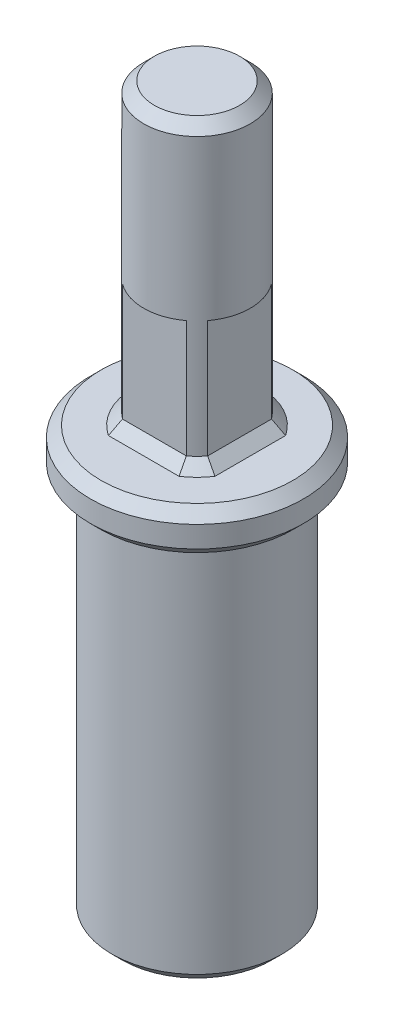
ISO-10303-21;
HEADER;
FILE_DESCRIPTION(('STEP AP214'),'2;1');
FILE_NAME('part.step','',(''),(''),'','','');
FILE_SCHEMA(('AUTOMOTIVE_DESIGN { 1 0 10303 214 1 1 1 1 }'));
ENDSEC;
DATA;
#1=APPLICATION_CONTEXT('core data for automotive mechanical design processes');
#2=APPLICATION_PROTOCOL_DEFINITION('international standard','automotive_design',2000,#1);
#3=PRODUCT_CONTEXT('',#1,'mechanical');
#4=PRODUCT('Part','Part','',(#3));
#5=PRODUCT_RELATED_PRODUCT_CATEGORY('part','',(#4));
#6=PRODUCT_DEFINITION_FORMATION('','',#4);
#7=PRODUCT_DEFINITION_CONTEXT('part definition',#1,'design');
#8=PRODUCT_DEFINITION('design','',#6,#7);
#9=PRODUCT_DEFINITION_SHAPE('','',#8);
#10=(LENGTH_UNIT() NAMED_UNIT(*) SI_UNIT(.MILLI.,.METRE.));
#11=(NAMED_UNIT(*) PLANE_ANGLE_UNIT() SI_UNIT($,.RADIAN.));
#12=(NAMED_UNIT(*) SI_UNIT($,.STERADIAN.) SOLID_ANGLE_UNIT());
#13=UNCERTAINTY_MEASURE_WITH_UNIT(LENGTH_MEASURE(1.E-05),#10,'distance_accuracy_value','');
#14=(GEOMETRIC_REPRESENTATION_CONTEXT(3) GLOBAL_UNCERTAINTY_ASSIGNED_CONTEXT((#13)) GLOBAL_UNIT_ASSIGNED_CONTEXT((#10,
#11,#12)) REPRESENTATION_CONTEXT('',''));
#15=CARTESIAN_POINT('',(0.,0.,0.));
#16=DIRECTION('',(0.,0.,1.));
#17=DIRECTION('',(1.,0.,0.));
#18=AXIS2_PLACEMENT_3D('',#15,#16,#17);
#19=CARTESIAN_POINT('',(0.,18.,0.));
#20=DIRECTION('',(0.,-1.,0.));
#21=DIRECTION('',(0.,0.,-1.));
#22=AXIS2_PLACEMENT_3D('',#19,#20,#21);
#23=CYLINDRICAL_SURFACE('',#22,4.);
#24=CARTESIAN_POINT('',(0.,0.500000000000004,0.));
#25=DIRECTION('',(0.,1.,0.));
#26=DIRECTION('',(0.,0.,1.));
#27=AXIS2_PLACEMENT_3D('',#24,#25,#26);
#28=CIRCLE('',#27,4.);
#29=CARTESIAN_POINT('',(0.,0.500000000000004,4.));
#30=VERTEX_POINT('',#29);
#31=EDGE_CURVE('E145',#30,#30,#28,.T.);
#32=ORIENTED_EDGE('',*,*,#31,.T.);
#33=EDGE_LOOP('',(#32));
#34=FACE_BOUND('',#33,.T.);
#35=CARTESIAN_POINT('',(0.,18.,0.));
#36=DIRECTION('',(0.,1.,0.));
#37=DIRECTION('',(0.,0.,1.));
#38=AXIS2_PLACEMENT_3D('',#35,#36,#37);
#39=CIRCLE('',#38,4.);
#40=CARTESIAN_POINT('',(0.,18.,4.));
#41=VERTEX_POINT('',#40);
#42=EDGE_CURVE('E130',#41,#41,#39,.T.);
#43=ORIENTED_EDGE('',*,*,#42,.F.);
#44=EDGE_LOOP('',(#43));
#45=FACE_BOUND('',#44,.T.);
#46=ADVANCED_FACE('F40',(#34,#45),#23,.T.);
#47=CARTESIAN_POINT('',(0.,0.,0.));
#48=DIRECTION('',(0.,1.,0.));
#49=DIRECTION('',(0.,0.,1.));
#50=AXIS2_PLACEMENT_3D('',#47,#48,#49);
#51=PLANE('',#50);
#52=CARTESIAN_POINT('',(0.,0.,0.));
#53=DIRECTION('',(0.,1.,0.));
#54=DIRECTION('',(0.,0.,1.));
#55=AXIS2_PLACEMENT_3D('',#52,#53,#54);
#56=CIRCLE('',#55,3.49999999999999);
#57=CARTESIAN_POINT('',(0.,0.,3.49999999999999));
#58=VERTEX_POINT('',#57);
#59=EDGE_CURVE('E149',#58,#58,#56,.F.);
#60=ORIENTED_EDGE('',*,*,#59,.T.);
#61=EDGE_LOOP('',(#60));
#62=FACE_BOUND('',#61,.T.);
#63=ADVANCED_FACE('F268',(#62),#51,.F.);
#64=CARTESIAN_POINT('',(0.,20.,0.));
#65=DIRECTION('',(0.,-1.,0.));
#66=DIRECTION('',(0.,0.,-1.));
#67=AXIS2_PLACEMENT_3D('',#64,#65,#66);
#68=CYLINDRICAL_SURFACE('',#67,5.);
#69=CARTESIAN_POINT('',(0.,19.5,0.));
#70=DIRECTION('',(0.,1.,0.));
#71=DIRECTION('',(0.,0.,1.));
#72=AXIS2_PLACEMENT_3D('',#69,#70,#71);
#73=CIRCLE('',#72,5.);
#74=CARTESIAN_POINT('',(0.,19.5,5.));
#75=VERTEX_POINT('',#74);
#76=EDGE_CURVE('E185',#75,#75,#73,.F.);
#77=ORIENTED_EDGE('',*,*,#76,.T.);
#78=EDGE_LOOP('',(#77));
#79=FACE_BOUND('',#78,.T.);
#80=CARTESIAN_POINT('',(0.,18.5,0.));
#81=DIRECTION('',(0.,1.,0.));
#82=DIRECTION('',(0.,0.,1.));
#83=AXIS2_PLACEMENT_3D('',#80,#81,#82);
#84=CIRCLE('',#83,5.);
#85=CARTESIAN_POINT('',(0.,18.5,5.));
#86=VERTEX_POINT('',#85);
#87=EDGE_CURVE('E181',#86,#86,#84,.T.);
#88=ORIENTED_EDGE('',*,*,#87,.T.);
#89=EDGE_LOOP('',(#88));
#90=FACE_BOUND('',#89,.T.);
#91=ADVANCED_FACE('F259',(#79,#90),#68,.T.);
#92=CARTESIAN_POINT('',(0.,20.,0.));
#93=DIRECTION('',(0.,1.,0.));
#94=DIRECTION('',(0.,0.,1.));
#95=AXIS2_PLACEMENT_3D('',#92,#93,#94);
#96=PLANE('',#95);
#97=CARTESIAN_POINT('',(0.,20.,0.));
#98=DIRECTION('',(0.,1.,0.));
#99=DIRECTION('',(0.,0.,1.));
#100=AXIS2_PLACEMENT_3D('',#97,#98,#99);
#101=CIRCLE('',#100,4.5);
#102=CARTESIAN_POINT('',(0.,20.,4.5));
#103=VERTEX_POINT('',#102);
#104=EDGE_CURVE('E177',#103,#103,#101,.T.);
#105=ORIENTED_EDGE('',*,*,#104,.T.);
#106=EDGE_LOOP('',(#105));
#107=FACE_BOUND('',#106,.T.);
#108=CARTESIAN_POINT('',(0.,20.,0.));
#109=DIRECTION('',(0.,1.,0.));
#110=DIRECTION('',(0.,0.,1.));
#111=AXIS2_PLACEMENT_3D('',#108,#109,#110);
#112=CIRCLE('',#111,2.99999999999999);
#113=CARTESIAN_POINT('',(-1.6583123951777,20.,2.49999999999999));
#114=VERTEX_POINT('',#113);
#115=CARTESIAN_POINT('',(2.49999999999999,20.,-1.6583123951777));
#116=VERTEX_POINT('',#115);
#117=EDGE_CURVE('E64',#114,#116,#112,.F.);
#118=ORIENTED_EDGE('',*,*,#117,.T.);
#119=DIRECTION('',(0.,0.,1.));
#120=VECTOR('',#119,1.);
#121=CARTESIAN_POINT('',(2.49999999999999,20.,0.));
#122=LINE('',#121,#120);
#123=CARTESIAN_POINT('',(2.49999999999999,20.,1.6583123951777));
#124=VERTEX_POINT('',#123);
#125=EDGE_CURVE('E174',#116,#124,#122,.T.);
#126=ORIENTED_EDGE('',*,*,#125,.T.);
#127=CARTESIAN_POINT('',(0.,20.,0.));
#128=DIRECTION('',(0.,1.,0.));
#129=DIRECTION('',(0.,0.,1.));
#130=AXIS2_PLACEMENT_3D('',#127,#128,#129);
#131=CIRCLE('',#130,2.99999999999999);
#132=CARTESIAN_POINT('',(1.6583123951777,20.,2.49999999999999));
#133=VERTEX_POINT('',#132);
#134=EDGE_CURVE('E167',#124,#133,#131,.F.);
#135=ORIENTED_EDGE('',*,*,#134,.T.);
#136=DIRECTION('',(-1.,0.,0.));
#137=VECTOR('',#136,1.);
#138=CARTESIAN_POINT('',(0.,20.,2.49999999999999));
#139=LINE('',#138,#137);
#140=EDGE_CURVE('E69',#133,#114,#139,.T.);
#141=ORIENTED_EDGE('',*,*,#140,.T.);
#142=EDGE_LOOP('',(#118,#126,#135,#141));
#143=FACE_BOUND('',#142,.T.);
#144=ADVANCED_FACE('F256',(#107,#143),#96,.T.);
#145=CARTESIAN_POINT('',(0.,18.,0.));
#146=DIRECTION('',(0.,1.,0.));
#147=DIRECTION('',(0.,0.,1.));
#148=AXIS2_PLACEMENT_3D('',#145,#146,#147);
#149=PLANE('',#148);
#150=CARTESIAN_POINT('',(0.,18.,0.));
#151=DIRECTION('',(0.,1.,0.));
#152=DIRECTION('',(0.,0.,1.));
#153=AXIS2_PLACEMENT_3D('',#150,#151,#152);
#154=CIRCLE('',#153,4.49999999999999);
#155=CARTESIAN_POINT('',(0.,18.,4.49999999999999));
#156=VERTEX_POINT('',#155);
#157=EDGE_CURVE('E11',#156,#156,#154,.F.);
#158=ORIENTED_EDGE('',*,*,#157,.T.);
#159=EDGE_LOOP('',(#158));
#160=FACE_BOUND('',#159,.T.);
#161=ORIENTED_EDGE('',*,*,#42,.T.);
#162=EDGE_LOOP('',(#161));
#163=FACE_BOUND('',#162,.T.);
#164=ADVANCED_FACE('F258',(#160,#163),#149,.F.);
#165=CARTESIAN_POINT('',(0.,34.,0.));
#166=DIRECTION('',(0.,-1.,0.));
#167=DIRECTION('',(0.,0.,-1.));
#168=AXIS2_PLACEMENT_3D('',#165,#166,#167);
#169=CYLINDRICAL_SURFACE('',#168,2.5);
#170=CARTESIAN_POINT('',(0.,33.5,0.));
#171=DIRECTION('',(0.,1.,0.));
#172=DIRECTION('',(0.,0.,1.));
#173=AXIS2_PLACEMENT_3D('',#170,#171,#172);
#174=CIRCLE('',#173,2.5);
#175=CARTESIAN_POINT('',(0.,33.5,2.5));
#176=VERTEX_POINT('',#175);
#177=EDGE_CURVE('E163',#176,#176,#174,.F.);
#178=ORIENTED_EDGE('',*,*,#177,.T.);
#179=EDGE_LOOP('',(#178));
#180=FACE_BOUND('',#179,.T.);
#181=DIRECTION('',(0.,1.,0.));
#182=VECTOR('',#181,1.);
#183=CARTESIAN_POINT('',(2.,16.9586187348509,-1.5));
#184=LINE('',#183,#182);
#185=CARTESIAN_POINT('',(2.,20.5,-1.5));
#186=VERTEX_POINT('',#185);
#187=CARTESIAN_POINT('',(2.,26.,-1.5));
#188=VERTEX_POINT('',#187);
#189=EDGE_CURVE('E126',#186,#188,#184,.T.);
#190=ORIENTED_EDGE('',*,*,#189,.F.);
#191=CARTESIAN_POINT('',(0.,20.5,0.));
#192=DIRECTION('',(0.,1.,0.));
#193=DIRECTION('',(0.,0.,1.));
#194=AXIS2_PLACEMENT_3D('',#191,#192,#193);
#195=CIRCLE('',#194,2.5);
#196=CARTESIAN_POINT('',(-1.5,20.5,2.));
#197=VERTEX_POINT('',#196);
#198=EDGE_CURVE('E160',#186,#197,#195,.T.);
#199=ORIENTED_EDGE('',*,*,#198,.T.);
#200=DIRECTION('',(0.,1.,0.));
#201=VECTOR('',#200,1.);
#202=CARTESIAN_POINT('',(-1.5,16.9586187348509,2.));
#203=LINE('',#202,#201);
#204=CARTESIAN_POINT('',(-1.5,26.,2.));
#205=VERTEX_POINT('',#204);
#206=EDGE_CURVE('E112',#197,#205,#203,.T.);
#207=ORIENTED_EDGE('',*,*,#206,.T.);
#208=CARTESIAN_POINT('',(0.,26.,0.));
#209=DIRECTION('',(0.,1.,0.));
#210=DIRECTION('',(0.,0.,1.));
#211=AXIS2_PLACEMENT_3D('',#208,#209,#210);
#212=CIRCLE('',#211,2.50000000000003);
#213=CARTESIAN_POINT('',(1.5,26.,2.));
#214=VERTEX_POINT('',#213);
#215=EDGE_CURVE('E117',#205,#214,#212,.T.);
#216=ORIENTED_EDGE('',*,*,#215,.T.);
#217=DIRECTION('',(0.,1.,0.));
#218=VECTOR('',#217,1.);
#219=CARTESIAN_POINT('',(1.5,16.9586187348509,2.));
#220=LINE('',#219,#218);
#221=CARTESIAN_POINT('',(1.5,20.5,2.));
#222=VERTEX_POINT('',#221);
#223=EDGE_CURVE('E102',#222,#214,#220,.T.);
#224=ORIENTED_EDGE('',*,*,#223,.F.);
#225=CARTESIAN_POINT('',(0.,20.5,0.));
#226=DIRECTION('',(0.,1.,0.));
#227=DIRECTION('',(0.,0.,1.));
#228=AXIS2_PLACEMENT_3D('',#225,#226,#227);
#229=CIRCLE('',#228,2.5);
#230=CARTESIAN_POINT('',(2.,20.5,1.5));
#231=VERTEX_POINT('',#230);
#232=EDGE_CURVE('E157',#222,#231,#229,.T.);
#233=ORIENTED_EDGE('',*,*,#232,.T.);
#234=DIRECTION('',(0.,1.,0.));
#235=VECTOR('',#234,1.);
#236=CARTESIAN_POINT('',(2.,16.9586187348509,1.5));
#237=LINE('',#236,#235);
#238=CARTESIAN_POINT('',(2.,26.,1.5));
#239=VERTEX_POINT('',#238);
#240=EDGE_CURVE('E123',#231,#239,#237,.T.);
#241=ORIENTED_EDGE('',*,*,#240,.T.);
#242=CARTESIAN_POINT('',(0.,26.,0.));
#243=DIRECTION('',(0.,1.,0.));
#244=DIRECTION('',(0.,0.,1.));
#245=AXIS2_PLACEMENT_3D('',#242,#243,#244);
#246=CIRCLE('',#245,2.50000000000005);
#247=EDGE_CURVE('E132',#239,#188,#246,.T.);
#248=ORIENTED_EDGE('',*,*,#247,.T.);
#249=EDGE_LOOP('',(#190,#199,#207,#216,#224,#233,#241,#248));
#250=FACE_BOUND('',#249,.T.);
#251=ADVANCED_FACE('F121',(#180,#250),#169,.T.);
#252=CARTESIAN_POINT('',(0.,34.,0.));
#253=DIRECTION('',(0.,1.,0.));
#254=DIRECTION('',(0.,0.,1.));
#255=AXIS2_PLACEMENT_3D('',#252,#253,#254);
#256=PLANE('',#255);
#257=CARTESIAN_POINT('',(0.,34.,0.));
#258=DIRECTION('',(0.,1.,0.));
#259=DIRECTION('',(0.,0.,1.));
#260=AXIS2_PLACEMENT_3D('',#257,#258,#259);
#261=CIRCLE('',#260,1.99999999999999);
#262=CARTESIAN_POINT('',(0.,34.,1.99999999999999));
#263=VERTEX_POINT('',#262);
#264=EDGE_CURVE('E153',#263,#263,#261,.T.);
#265=ORIENTED_EDGE('',*,*,#264,.T.);
#266=EDGE_LOOP('',(#265));
#267=FACE_BOUND('',#266,.T.);
#268=ADVANCED_FACE('F367',(#267),#256,.T.);
#269=CARTESIAN_POINT('',(2.,16.9586187348509,-1.5));
#270=DIRECTION('',(-1.,0.,0.));
#271=DIRECTION('',(0.,0.,1.));
#272=AXIS2_PLACEMENT_3D('',#269,#270,#271);
#273=PLANE('',#272);
#274=ORIENTED_EDGE('',*,*,#240,.F.);
#275=DIRECTION('',(0.,0.,-1.));
#276=VECTOR('',#275,1.);
#277=CARTESIAN_POINT('',(2.,20.5,-1.5));
#278=LINE('',#277,#276);
#279=EDGE_CURVE('E189',#231,#186,#278,.T.);
#280=ORIENTED_EDGE('',*,*,#279,.T.);
#281=ORIENTED_EDGE('',*,*,#189,.T.);
#282=DIRECTION('',(0.,0.,1.));
#283=VECTOR('',#282,1.);
#284=CARTESIAN_POINT('',(2.,26.,-1.5));
#285=LINE('',#284,#283);
#286=EDGE_CURVE('E136',#188,#239,#285,.T.);
#287=ORIENTED_EDGE('',*,*,#286,.T.);
#288=EDGE_LOOP('',(#274,#280,#281,#287));
#289=FACE_BOUND('',#288,.T.);
#290=ADVANCED_FACE('F363',(#289),#273,.F.);
#291=CARTESIAN_POINT('',(0.,26.,0.));
#292=DIRECTION('',(0.,1.,0.));
#293=DIRECTION('',(0.,0.,1.));
#294=AXIS2_PLACEMENT_3D('',#291,#292,#293);
#295=PLANE('',#294);
#296=ORIENTED_EDGE('',*,*,#247,.F.);
#297=ORIENTED_EDGE('',*,*,#286,.F.);
#298=EDGE_LOOP('',(#296,#297));
#299=FACE_BOUND('',#298,.T.);
#300=ADVANCED_FACE('F358',(#299),#295,.F.);
#301=CARTESIAN_POINT('',(-1.5,16.9586187348509,2.));
#302=DIRECTION('',(0.,0.,-1.));
#303=DIRECTION('',(-1.,0.,0.));
#304=AXIS2_PLACEMENT_3D('',#301,#302,#303);
#305=PLANE('',#304);
#306=ORIENTED_EDGE('',*,*,#206,.F.);
#307=DIRECTION('',(1.,0.,0.));
#308=VECTOR('',#307,1.);
#309=CARTESIAN_POINT('',(-1.5,20.5,2.));
#310=LINE('',#309,#308);
#311=EDGE_CURVE('E56',#197,#222,#310,.T.);
#312=ORIENTED_EDGE('',*,*,#311,.T.);
#313=ORIENTED_EDGE('',*,*,#223,.T.);
#314=DIRECTION('',(-1.,0.,0.));
#315=VECTOR('',#314,1.);
#316=CARTESIAN_POINT('',(-1.5,26.,2.));
#317=LINE('',#316,#315);
#318=EDGE_CURVE('E106',#214,#205,#317,.T.);
#319=ORIENTED_EDGE('',*,*,#318,.T.);
#320=EDGE_LOOP('',(#306,#312,#313,#319));
#321=FACE_BOUND('',#320,.T.);
#322=ADVANCED_FACE('F105',(#321),#305,.F.);
#323=CARTESIAN_POINT('',(0.,26.,0.));
#324=DIRECTION('',(0.,1.,0.));
#325=DIRECTION('',(0.,0.,1.));
#326=AXIS2_PLACEMENT_3D('',#323,#324,#325);
#327=PLANE('',#326);
#328=ORIENTED_EDGE('',*,*,#215,.F.);
#329=ORIENTED_EDGE('',*,*,#318,.F.);
#330=EDGE_LOOP('',(#328,#329));
#331=FACE_BOUND('',#330,.T.);
#332=ADVANCED_FACE('F116',(#331),#327,.F.);
#333=CARTESIAN_POINT('',(0.,0.500000000000004,0.));
#334=DIRECTION('',(0.,1.,0.));
#335=DIRECTION('',(0.,0.,1.));
#336=AXIS2_PLACEMENT_3D('',#333,#334,#335);
#337=CONICAL_SURFACE('',#336,4.,0.785398163397452);
#338=ORIENTED_EDGE('',*,*,#59,.F.);
#339=EDGE_LOOP('',(#338));
#340=FACE_BOUND('',#339,.T.);
#341=ORIENTED_EDGE('',*,*,#31,.F.);
#342=EDGE_LOOP('',(#341));
#343=FACE_BOUND('',#342,.T.);
#344=ADVANCED_FACE('F284',(#340,#343),#337,.T.);
#345=CARTESIAN_POINT('',(0.,34.,0.));
#346=DIRECTION('',(0.,-1.,0.));
#347=DIRECTION('',(0.,0.,-1.));
#348=AXIS2_PLACEMENT_3D('',#345,#346,#347);
#349=CONICAL_SURFACE('',#348,1.99999999999999,0.785398163397446);
#350=ORIENTED_EDGE('',*,*,#177,.F.);
#351=EDGE_LOOP('',(#350));
#352=FACE_BOUND('',#351,.T.);
#353=ORIENTED_EDGE('',*,*,#264,.F.);
#354=EDGE_LOOP('',(#353));
#355=FACE_BOUND('',#354,.T.);
#356=ADVANCED_FACE('F290',(#352,#355),#349,.T.);
#357=CARTESIAN_POINT('',(0.,20.,0.));
#358=DIRECTION('',(0.,-1.,0.));
#359=DIRECTION('',(0.,0.,-1.));
#360=AXIS2_PLACEMENT_3D('',#357,#358,#359);
#361=CONICAL_SURFACE('',#360,4.5,0.785398163397447);
#362=ORIENTED_EDGE('',*,*,#76,.F.);
#363=EDGE_LOOP('',(#362));
#364=FACE_BOUND('',#363,.T.);
#365=ORIENTED_EDGE('',*,*,#104,.F.);
#366=EDGE_LOOP('',(#365));
#367=FACE_BOUND('',#366,.T.);
#368=ADVANCED_FACE('F236',(#364,#367),#361,.T.);
#369=CARTESIAN_POINT('',(-1.5,20.5,2.));
#370=DIRECTION('',(0.,-0.707106781186542,-0.707106781186553));
#371=DIRECTION('',(1.,0.,0.));
#372=AXIS2_PLACEMENT_3D('',#369,#370,#371);
#373=PLANE('',#372);
#374=CARTESIAN_POINT('',(-1.5,20.5,2.));
#375=CARTESIAN_POINT('',(-1.52764420802877,20.4168657245626,2.08313427543744));
#376=CARTESIAN_POINT('',(-1.55465904424928,20.3336318117732,2.16636818822682));
#377=CARTESIAN_POINT('',(-1.60742983610777,20.1669651440721,2.33303485592791));
#378=CARTESIAN_POINT('',(-1.63318579827982,20.0835323901948,2.41646760980519));
#379=CARTESIAN_POINT('',(-1.6583123951777,20.,2.49999999999999));
#380=B_SPLINE_CURVE_WITH_KNOTS('',3,(#374,#375,#376,#377,#378,#379),.UNSPECIFIED.,.F.,.F.,(4,2,
4),(0.,0.36231219779679,0.724622514843546),.UNSPECIFIED.);
#381=EDGE_CURVE('E239',#114,#197,#380,.F.);
#382=ORIENTED_EDGE('',*,*,#381,.F.);
#383=ORIENTED_EDGE('',*,*,#140,.F.);
#384=CARTESIAN_POINT('',(1.5,20.5,2.));
#385=CARTESIAN_POINT('',(1.52764420802877,20.4168657245626,2.08313427543744));
#386=CARTESIAN_POINT('',(1.55465904424928,20.3336318117732,2.16636818822682));
#387=CARTESIAN_POINT('',(1.60742983610777,20.1669651440721,2.33303485592791));
#388=CARTESIAN_POINT('',(1.63318579827982,20.0835323901948,2.41646760980519));
#389=CARTESIAN_POINT('',(1.6583123951777,20.,2.49999999999999));
#390=B_SPLINE_CURVE_WITH_KNOTS('',3,(#384,#385,#386,#387,#388,#389),.UNSPECIFIED.,.F.,.F.,(4,2,
4),(0.,0.36231219779679,0.724622514843547),.UNSPECIFIED.);
#391=EDGE_CURVE('E45',#222,#133,#390,.T.);
#392=ORIENTED_EDGE('',*,*,#391,.F.);
#393=ORIENTED_EDGE('',*,*,#311,.F.);
#394=EDGE_LOOP('',(#382,#383,#392,#393));
#395=FACE_BOUND('',#394,.T.);
#396=ADVANCED_FACE('F228',(#395),#373,.F.);
#397=CARTESIAN_POINT('',(0.,20.5,0.));
#398=DIRECTION('',(0.,-1.,0.));
#399=DIRECTION('',(0.,0.,-1.));
#400=AXIS2_PLACEMENT_3D('',#397,#398,#399);
#401=CONICAL_SURFACE('',#400,2.5,0.785398163397441);
#402=ORIENTED_EDGE('',*,*,#391,.T.);
#403=ORIENTED_EDGE('',*,*,#134,.F.);
#404=CARTESIAN_POINT('',(2.49999999999999,20.,1.6583123951777));
#405=CARTESIAN_POINT('',(2.41646760980519,20.0835323901948,1.63318579827982));
#406=CARTESIAN_POINT('',(2.33303485592791,20.1669651440721,1.60742983610777));
#407=CARTESIAN_POINT('',(2.16636818822682,20.3336318117732,1.55465904424928));
#408=CARTESIAN_POINT('',(2.08313427543744,20.4168657245626,1.52764420802877));
#409=CARTESIAN_POINT('',(2.,20.5,1.5));
#410=B_SPLINE_CURVE_WITH_KNOTS('',3,(#404,#405,#406,#407,#408,#409),.UNSPECIFIED.,.F.,.F.,(4,2,
4),(0.,0.362310317046757,0.724622514843547),.UNSPECIFIED.);
#411=EDGE_CURVE('E204',#231,#124,#410,.F.);
#412=ORIENTED_EDGE('',*,*,#411,.F.);
#413=ORIENTED_EDGE('',*,*,#232,.F.);
#414=EDGE_LOOP('',(#402,#403,#412,#413));
#415=FACE_BOUND('',#414,.T.);
#416=ADVANCED_FACE('F221',(#415),#401,.T.);
#417=CARTESIAN_POINT('',(0.,20.5,0.));
#418=DIRECTION('',(0.,-1.,0.));
#419=DIRECTION('',(0.,0.,-1.));
#420=AXIS2_PLACEMENT_3D('',#417,#418,#419);
#421=CONICAL_SURFACE('',#420,2.5,0.785398163397441);
#422=ORIENTED_EDGE('',*,*,#381,.T.);
#423=ORIENTED_EDGE('',*,*,#198,.F.);
#424=CARTESIAN_POINT('',(2.,20.5,-1.5));
#425=CARTESIAN_POINT('',(2.08313427543744,20.4168657245626,-1.52764420802877));
#426=CARTESIAN_POINT('',(2.16636818822682,20.3336318117732,-1.55465904424928));
#427=CARTESIAN_POINT('',(2.33303485592791,20.1669651440721,-1.60742983610777));
#428=CARTESIAN_POINT('',(2.41646760980519,20.0835323901948,-1.63318579827982));
#429=CARTESIAN_POINT('',(2.49999999999999,20.,-1.6583123951777));
#430=B_SPLINE_CURVE_WITH_KNOTS('',3,(#424,#425,#426,#427,#428,#429),.UNSPECIFIED.,.F.,.F.,(4,2,
4),(0.,0.36231219779679,0.724622514843546),.UNSPECIFIED.);
#431=EDGE_CURVE('E195',#116,#186,#430,.F.);
#432=ORIENTED_EDGE('',*,*,#431,.F.);
#433=ORIENTED_EDGE('',*,*,#117,.F.);
#434=EDGE_LOOP('',(#422,#423,#432,#433));
#435=FACE_BOUND('',#434,.T.);
#436=ADVANCED_FACE('F210',(#435),#421,.T.);
#437=CARTESIAN_POINT('',(2.,20.5,-1.5));
#438=DIRECTION('',(-0.707106781186553,-0.707106781186542,0.));
#439=DIRECTION('',(0.,0.,-1.));
#440=AXIS2_PLACEMENT_3D('',#437,#438,#439);
#441=PLANE('',#440);
#442=ORIENTED_EDGE('',*,*,#411,.T.);
#443=ORIENTED_EDGE('',*,*,#125,.F.);
#444=ORIENTED_EDGE('',*,*,#431,.T.);
#445=ORIENTED_EDGE('',*,*,#279,.F.);
#446=EDGE_LOOP('',(#442,#443,#444,#445));
#447=FACE_BOUND('',#446,.T.);
#448=ADVANCED_FACE('F214',(#447),#441,.F.);
#449=CARTESIAN_POINT('',(0.,18.5,0.));
#450=DIRECTION('',(0.,1.,0.));
#451=DIRECTION('',(0.,0.,1.));
#452=AXIS2_PLACEMENT_3D('',#449,#450,#451);
#453=CONICAL_SURFACE('',#452,5.,0.785398163397458);
#454=ORIENTED_EDGE('',*,*,#157,.F.);
#455=EDGE_LOOP('',(#454));
#456=FACE_BOUND('',#455,.T.);
#457=ORIENTED_EDGE('',*,*,#87,.F.);
#458=EDGE_LOOP('',(#457));
#459=FACE_BOUND('',#458,.T.);
#460=ADVANCED_FACE('F43',(#456,#459),#453,.T.);
#461=CLOSED_SHELL('',(#46,#63,#91,#144,#164,#251,#268,#290,#300,#322,#332,#344,#356,#368,#396,
#416,#436,#448,#460));
#462=MANIFOLD_SOLID_BREP('B2',#461);
#463=ADVANCED_BREP_SHAPE_REPRESENTATION('',(#18,#462),#14);
#464=SHAPE_DEFINITION_REPRESENTATION(#9,#463);
ENDSEC;
END-ISO-10303-21;
